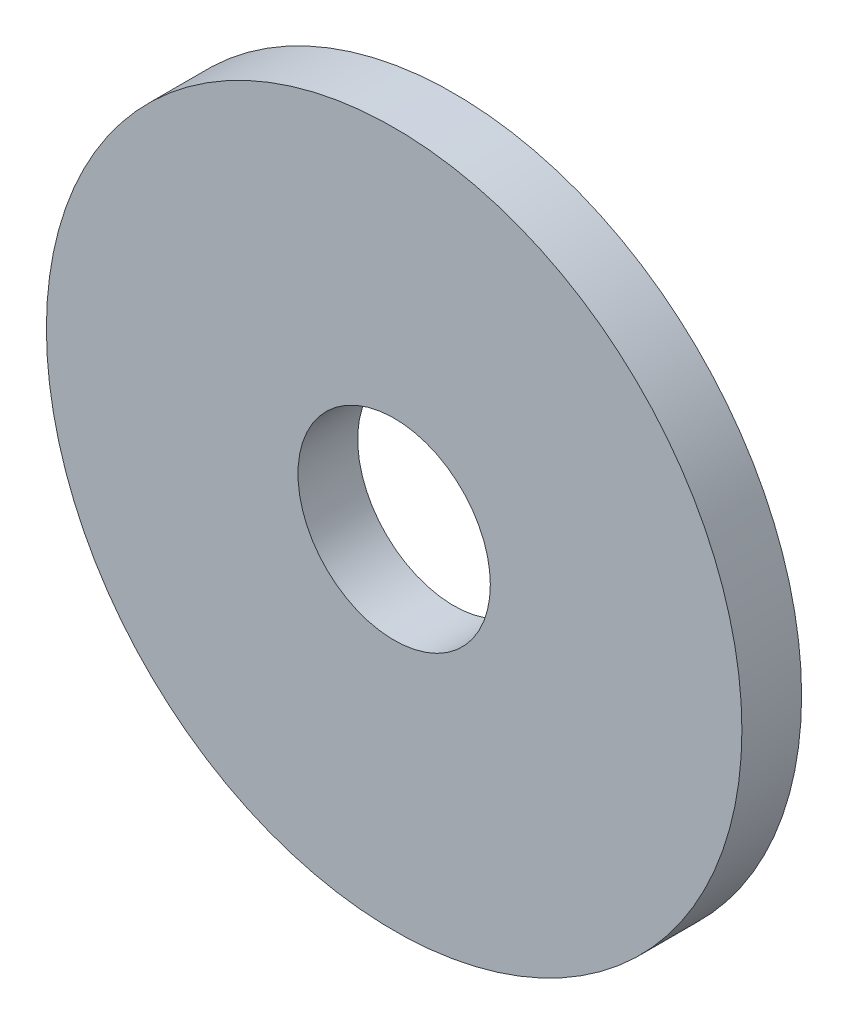
ISO-10303-21;
HEADER;
FILE_DESCRIPTION(('STEP AP214'),'2;1');
FILE_NAME('part.step','',(''),(''),'','','');
FILE_SCHEMA(('AUTOMOTIVE_DESIGN { 1 0 10303 214 1 1 1 1 }'));
ENDSEC;
DATA;
#1=APPLICATION_CONTEXT('core data for automotive mechanical design processes');
#2=APPLICATION_PROTOCOL_DEFINITION('international standard','automotive_design',2000,#1);
#3=PRODUCT_CONTEXT('',#1,'mechanical');
#4=PRODUCT('Part','Part','',(#3));
#5=PRODUCT_RELATED_PRODUCT_CATEGORY('part','',(#4));
#6=PRODUCT_DEFINITION_FORMATION('','',#4);
#7=PRODUCT_DEFINITION_CONTEXT('part definition',#1,'design');
#8=PRODUCT_DEFINITION('design','',#6,#7);
#9=PRODUCT_DEFINITION_SHAPE('','',#8);
#10=(LENGTH_UNIT() NAMED_UNIT(*) SI_UNIT(.MILLI.,.METRE.));
#11=(NAMED_UNIT(*) PLANE_ANGLE_UNIT() SI_UNIT($,.RADIAN.));
#12=(NAMED_UNIT(*) SI_UNIT($,.STERADIAN.) SOLID_ANGLE_UNIT());
#13=UNCERTAINTY_MEASURE_WITH_UNIT(LENGTH_MEASURE(1.E-05),#10,'distance_accuracy_value','');
#14=(GEOMETRIC_REPRESENTATION_CONTEXT(3) GLOBAL_UNCERTAINTY_ASSIGNED_CONTEXT((#13)) GLOBAL_UNIT_ASSIGNED_CONTEXT((#10,
#11,#12)) REPRESENTATION_CONTEXT('',''));
#15=CARTESIAN_POINT('',(0.,0.,0.));
#16=DIRECTION('',(0.,0.,1.));
#17=DIRECTION('',(1.,0.,0.));
#18=AXIS2_PLACEMENT_3D('',#15,#16,#17);
#19=CARTESIAN_POINT('',(0.,0.,1.6002));
#20=DIRECTION('',(0.,0.,-1.));
#21=DIRECTION('',(-1.,0.,0.));
#22=AXIS2_PLACEMENT_3D('',#19,#20,#21);
#23=CYLINDRICAL_SURFACE('',#22,2.5781);
#24=CARTESIAN_POINT('',(0.,0.,1.6002));
#25=DIRECTION('',(0.,0.,1.));
#26=DIRECTION('',(1.,0.,0.));
#27=AXIS2_PLACEMENT_3D('',#24,#25,#26);
#28=CIRCLE('',#27,2.5781);
#29=CARTESIAN_POINT('',(2.5781,0.,1.6002));
#30=VERTEX_POINT('',#29);
#31=EDGE_CURVE('E22',#30,#30,#28,.T.);
#32=ORIENTED_EDGE('',*,*,#31,.T.);
#33=EDGE_LOOP('',(#32));
#34=FACE_BOUND('',#33,.T.);
#35=CARTESIAN_POINT('',(0.,0.,0.));
#36=DIRECTION('',(0.,0.,1.));
#37=DIRECTION('',(1.,0.,0.));
#38=AXIS2_PLACEMENT_3D('',#35,#36,#37);
#39=CIRCLE('',#38,2.5781);
#40=CARTESIAN_POINT('',(2.5781,0.,0.));
#41=VERTEX_POINT('',#40);
#42=EDGE_CURVE('E28',#41,#41,#39,.T.);
#43=ORIENTED_EDGE('',*,*,#42,.F.);
#44=EDGE_LOOP('',(#43));
#45=FACE_BOUND('',#44,.T.);
#46=ADVANCED_FACE('F15',(#34,#45),#23,.F.);
#47=CARTESIAN_POINT('',(0.,0.,1.6002));
#48=DIRECTION('',(0.,0.,-1.));
#49=DIRECTION('',(-1.,0.,0.));
#50=AXIS2_PLACEMENT_3D('',#47,#48,#49);
#51=CYLINDRICAL_SURFACE('',#50,9.3218);
#52=CARTESIAN_POINT('',(0.,0.,1.6002));
#53=DIRECTION('',(0.,0.,1.));
#54=DIRECTION('',(1.,0.,0.));
#55=AXIS2_PLACEMENT_3D('',#52,#53,#54);
#56=CIRCLE('',#55,9.3218);
#57=CARTESIAN_POINT('',(9.3218,0.,1.6002));
#58=VERTEX_POINT('',#57);
#59=EDGE_CURVE('E10',#58,#58,#56,.T.);
#60=ORIENTED_EDGE('',*,*,#59,.F.);
#61=EDGE_LOOP('',(#60));
#62=FACE_BOUND('',#61,.T.);
#63=CARTESIAN_POINT('',(0.,0.,0.));
#64=DIRECTION('',(0.,0.,1.));
#65=DIRECTION('',(1.,0.,0.));
#66=AXIS2_PLACEMENT_3D('',#63,#64,#65);
#67=CIRCLE('',#66,9.3218);
#68=CARTESIAN_POINT('',(9.3218,0.,0.));
#69=VERTEX_POINT('',#68);
#70=EDGE_CURVE('E18',#69,#69,#67,.T.);
#71=ORIENTED_EDGE('',*,*,#70,.T.);
#72=EDGE_LOOP('',(#71));
#73=FACE_BOUND('',#72,.T.);
#74=ADVANCED_FACE('F35',(#62,#73),#51,.T.);
#75=CARTESIAN_POINT('',(0.,0.,1.6002));
#76=DIRECTION('',(0.,0.,1.));
#77=DIRECTION('',(1.,0.,0.));
#78=AXIS2_PLACEMENT_3D('',#75,#76,#77);
#79=PLANE('',#78);
#80=ORIENTED_EDGE('',*,*,#31,.F.);
#81=EDGE_LOOP('',(#80));
#82=FACE_BOUND('',#81,.T.);
#83=ORIENTED_EDGE('',*,*,#59,.T.);
#84=EDGE_LOOP('',(#83));
#85=FACE_BOUND('',#84,.T.);
#86=ADVANCED_FACE('F39',(#82,#85),#79,.T.);
#87=CARTESIAN_POINT('',(0.,0.,0.));
#88=DIRECTION('',(0.,0.,1.));
#89=DIRECTION('',(1.,0.,0.));
#90=AXIS2_PLACEMENT_3D('',#87,#88,#89);
#91=PLANE('',#90);
#92=ORIENTED_EDGE('',*,*,#42,.T.);
#93=EDGE_LOOP('',(#92));
#94=FACE_BOUND('',#93,.T.);
#95=ORIENTED_EDGE('',*,*,#70,.F.);
#96=EDGE_LOOP('',(#95));
#97=FACE_BOUND('',#96,.T.);
#98=ADVANCED_FACE('F37',(#94,#97),#91,.F.);
#99=CLOSED_SHELL('',(#46,#74,#86,#98));
#100=MANIFOLD_SOLID_BREP('B1',#99);
#101=ADVANCED_BREP_SHAPE_REPRESENTATION('',(#18,#100),#14);
#102=SHAPE_DEFINITION_REPRESENTATION(#9,#101);
ENDSEC;
END-ISO-10303-21;
